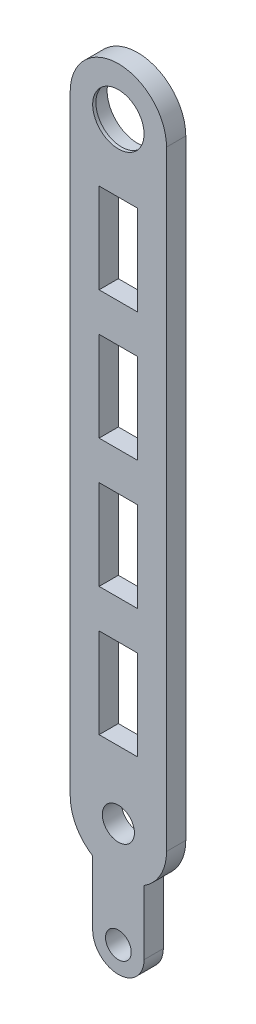
ISO-10303-21;
HEADER;
FILE_DESCRIPTION(('STEP AP214'),'2;1');
FILE_NAME('part.step','',(''),(''),'','','');
FILE_SCHEMA(('AUTOMOTIVE_DESIGN { 1 0 10303 214 1 1 1 1 }'));
ENDSEC;
DATA;
#1=APPLICATION_CONTEXT('core data for automotive mechanical design processes');
#2=APPLICATION_PROTOCOL_DEFINITION('international standard','automotive_design',2000,#1);
#3=PRODUCT_CONTEXT('',#1,'mechanical');
#4=PRODUCT('Part','Part','',(#3));
#5=PRODUCT_RELATED_PRODUCT_CATEGORY('part','',(#4));
#6=PRODUCT_DEFINITION_FORMATION('','',#4);
#7=PRODUCT_DEFINITION_CONTEXT('part definition',#1,'design');
#8=PRODUCT_DEFINITION('design','',#6,#7);
#9=PRODUCT_DEFINITION_SHAPE('','',#8);
#10=(LENGTH_UNIT() NAMED_UNIT(*) SI_UNIT(.MILLI.,.METRE.));
#11=(NAMED_UNIT(*) PLANE_ANGLE_UNIT() SI_UNIT($,.RADIAN.));
#12=(NAMED_UNIT(*) SI_UNIT($,.STERADIAN.) SOLID_ANGLE_UNIT());
#13=UNCERTAINTY_MEASURE_WITH_UNIT(LENGTH_MEASURE(1.E-05),#10,'distance_accuracy_value','');
#14=(GEOMETRIC_REPRESENTATION_CONTEXT(3) GLOBAL_UNCERTAINTY_ASSIGNED_CONTEXT((#13)) GLOBAL_UNIT_ASSIGNED_CONTEXT((#10,
#11,#12)) REPRESENTATION_CONTEXT('',''));
#15=CARTESIAN_POINT('',(0.,0.,0.));
#16=DIRECTION('',(0.,0.,1.));
#17=DIRECTION('',(1.,0.,0.));
#18=AXIS2_PLACEMENT_3D('',#15,#16,#17);
#19=CARTESIAN_POINT('',(0.,95.,6.));
#20=DIRECTION('',(0.,0.,-1.));
#21=DIRECTION('',(-1.,0.,0.));
#22=AXIS2_PLACEMENT_3D('',#19,#20,#21);
#23=CYLINDRICAL_SURFACE('',#22,9.5);
#24=CARTESIAN_POINT('',(0.,95.,0.));
#25=DIRECTION('',(0.,0.,1.));
#26=DIRECTION('',(1.,0.,0.));
#27=AXIS2_PLACEMENT_3D('',#24,#25,#26);
#28=CIRCLE('',#27,9.5);
#29=CARTESIAN_POINT('',(9.5,95.,0.));
#30=VERTEX_POINT('',#29);
#31=EDGE_CURVE('E350',#30,#30,#28,.T.);
#32=ORIENTED_EDGE('',*,*,#31,.F.);
#33=EDGE_LOOP('',(#32));
#34=FACE_BOUND('',#33,.T.);
#35=CARTESIAN_POINT('',(0.,95.,5.));
#36=DIRECTION('',(0.,0.,1.));
#37=DIRECTION('',(1.,0.,0.));
#38=AXIS2_PLACEMENT_3D('',#35,#36,#37);
#39=CIRCLE('',#38,9.5);
#40=CARTESIAN_POINT('',(9.5,95.,5.));
#41=VERTEX_POINT('',#40);
#42=EDGE_CURVE('E231',#41,#41,#39,.T.);
#43=ORIENTED_EDGE('',*,*,#42,.T.);
#44=EDGE_LOOP('',(#43));
#45=FACE_BOUND('',#44,.T.);
#46=ADVANCED_FACE('F43',(#34,#45),#23,.F.);
#47=CARTESIAN_POINT('',(0.,95.,6.));
#48=DIRECTION('',(0.,0.,1.));
#49=DIRECTION('',(1.,0.,0.));
#50=AXIS2_PLACEMENT_3D('',#47,#48,#49);
#51=PLANE('',#50);
#52=DIRECTION('',(0.,1.,0.));
#53=VECTOR('',#52,1.);
#54=CARTESIAN_POINT('',(6.00000000000322,74.,6.));
#55=LINE('',#54,#53);
#56=CARTESIAN_POINT('',(6.00000000000323,46.,6.));
#57=VERTEX_POINT('',#56);
#58=CARTESIAN_POINT('',(6.00000000000322,74.,6.));
#59=VERTEX_POINT('',#58);
#60=EDGE_CURVE('E58',#57,#59,#55,.T.);
#61=ORIENTED_EDGE('',*,*,#60,.F.);
#62=DIRECTION('',(1.,0.,0.));
#63=VECTOR('',#62,1.);
#64=CARTESIAN_POINT('',(-5.99999999999678,46.,6.));
#65=LINE('',#64,#63);
#66=CARTESIAN_POINT('',(-5.99999999999678,46.,6.));
#67=VERTEX_POINT('',#66);
#68=EDGE_CURVE('E225',#67,#57,#65,.T.);
#69=ORIENTED_EDGE('',*,*,#68,.F.);
#70=DIRECTION('',(0.,-1.,0.));
#71=VECTOR('',#70,1.);
#72=CARTESIAN_POINT('',(-5.99999999999678,74.,6.));
#73=LINE('',#72,#71);
#74=CARTESIAN_POINT('',(-5.99999999999678,74.,6.));
#75=VERTEX_POINT('',#74);
#76=EDGE_CURVE('E228',#75,#67,#73,.T.);
#77=ORIENTED_EDGE('',*,*,#76,.F.);
#78=DIRECTION('',(-1.,0.,0.));
#79=VECTOR('',#78,1.);
#80=CARTESIAN_POINT('',(-5.99999999999678,74.,6.));
#81=LINE('',#80,#79);
#82=EDGE_CURVE('E237',#59,#75,#81,.T.);
#83=ORIENTED_EDGE('',*,*,#82,.F.);
#84=EDGE_LOOP('',(#61,#69,#77,#83));
#85=FACE_BOUND('',#84,.T.);
#86=DIRECTION('',(0.,1.,0.));
#87=VECTOR('',#86,1.);
#88=CARTESIAN_POINT('',(6.00000000000343,34.,6.));
#89=LINE('',#88,#87);
#90=CARTESIAN_POINT('',(6.00000000000343,5.99999999999989,6.));
#91=VERTEX_POINT('',#90);
#92=CARTESIAN_POINT('',(6.00000000000343,34.,6.));
#93=VERTEX_POINT('',#92);
#94=EDGE_CURVE('E66',#91,#93,#89,.T.);
#95=ORIENTED_EDGE('',*,*,#94,.F.);
#96=DIRECTION('',(1.,0.,0.));
#97=VECTOR('',#96,1.);
#98=CARTESIAN_POINT('',(-5.99999999999657,5.99999999999989,6.));
#99=LINE('',#98,#97);
#100=CARTESIAN_POINT('',(-5.99999999999657,5.99999999999989,6.));
#101=VERTEX_POINT('',#100);
#102=EDGE_CURVE('E252',#101,#91,#99,.T.);
#103=ORIENTED_EDGE('',*,*,#102,.F.);
#104=DIRECTION('',(0.,-1.,0.));
#105=VECTOR('',#104,1.);
#106=CARTESIAN_POINT('',(-5.99999999999657,34.,6.));
#107=LINE('',#106,#105);
#108=CARTESIAN_POINT('',(-5.99999999999657,34.,6.));
#109=VERTEX_POINT('',#108);
#110=EDGE_CURVE('E267',#109,#101,#107,.T.);
#111=ORIENTED_EDGE('',*,*,#110,.F.);
#112=DIRECTION('',(-1.,0.,0.));
#113=VECTOR('',#112,1.);
#114=CARTESIAN_POINT('',(-5.99999999999657,34.,6.));
#115=LINE('',#114,#113);
#116=EDGE_CURVE('E263',#93,#109,#115,.T.);
#117=ORIENTED_EDGE('',*,*,#116,.F.);
#118=EDGE_LOOP('',(#95,#103,#111,#117));
#119=FACE_BOUND('',#118,.T.);
#120=DIRECTION('',(0.,1.,0.));
#121=VECTOR('',#120,1.);
#122=CARTESIAN_POINT('',(6.00000000000325,-6.00000000000011,6.));
#123=LINE('',#122,#121);
#124=CARTESIAN_POINT('',(6.00000000000326,-34.,6.));
#125=VERTEX_POINT('',#124);
#126=CARTESIAN_POINT('',(6.00000000000325,-6.0000000000001,6.));
#127=VERTEX_POINT('',#126);
#128=EDGE_CURVE('E292',#125,#127,#123,.T.);
#129=ORIENTED_EDGE('',*,*,#128,.F.);
#130=DIRECTION('',(1.,0.,0.));
#131=VECTOR('',#130,1.);
#132=CARTESIAN_POINT('',(-5.99999999999675,-34.,6.));
#133=LINE('',#132,#131);
#134=CARTESIAN_POINT('',(-5.99999999999675,-34.,6.));
#135=VERTEX_POINT('',#134);
#136=EDGE_CURVE('E282',#135,#125,#133,.T.);
#137=ORIENTED_EDGE('',*,*,#136,.F.);
#138=DIRECTION('',(0.,-1.,0.));
#139=VECTOR('',#138,1.);
#140=CARTESIAN_POINT('',(-5.99999999999675,-6.00000000000011,6.));
#141=LINE('',#140,#139);
#142=CARTESIAN_POINT('',(-5.99999999999675,-6.00000000000011,6.));
#143=VERTEX_POINT('',#142);
#144=EDGE_CURVE('E298',#143,#135,#141,.T.);
#145=ORIENTED_EDGE('',*,*,#144,.F.);
#146=DIRECTION('',(-1.,0.,0.));
#147=VECTOR('',#146,1.);
#148=CARTESIAN_POINT('',(-5.99999999999675,-6.00000000000011,6.));
#149=LINE('',#148,#147);
#150=EDGE_CURVE('E294',#127,#143,#149,.T.);
#151=ORIENTED_EDGE('',*,*,#150,.F.);
#152=EDGE_LOOP('',(#129,#137,#145,#151));
#153=FACE_BOUND('',#152,.T.);
#154=DIRECTION('',(0.,1.,0.));
#155=VECTOR('',#154,1.);
#156=CARTESIAN_POINT('',(6.00000000000325,-46.,6.));
#157=LINE('',#156,#155);
#158=CARTESIAN_POINT('',(6.00000000000326,-74.,6.));
#159=VERTEX_POINT('',#158);
#160=CARTESIAN_POINT('',(6.00000000000325,-46.,6.));
#161=VERTEX_POINT('',#160);
#162=EDGE_CURVE('E324',#159,#161,#157,.T.);
#163=ORIENTED_EDGE('',*,*,#162,.F.);
#164=DIRECTION('',(1.,0.,0.));
#165=VECTOR('',#164,1.);
#166=CARTESIAN_POINT('',(-5.99999999999674,-74.,6.));
#167=LINE('',#166,#165);
#168=CARTESIAN_POINT('',(-5.99999999999674,-74.,6.));
#169=VERTEX_POINT('',#168);
#170=EDGE_CURVE('E314',#169,#159,#167,.T.);
#171=ORIENTED_EDGE('',*,*,#170,.F.);
#172=DIRECTION('',(0.,-1.,0.));
#173=VECTOR('',#172,1.);
#174=CARTESIAN_POINT('',(-5.99999999999675,-46.,6.));
#175=LINE('',#174,#173);
#176=CARTESIAN_POINT('',(-5.99999999999675,-46.,6.));
#177=VERTEX_POINT('',#176);
#178=EDGE_CURVE('E329',#177,#169,#175,.T.);
#179=ORIENTED_EDGE('',*,*,#178,.F.);
#180=DIRECTION('',(-1.,0.,0.));
#181=VECTOR('',#180,1.);
#182=CARTESIAN_POINT('',(-5.99999999999675,-46.,6.));
#183=LINE('',#182,#181);
#184=EDGE_CURVE('E326',#161,#177,#183,.T.);
#185=ORIENTED_EDGE('',*,*,#184,.F.);
#186=EDGE_LOOP('',(#163,#171,#179,#185));
#187=FACE_BOUND('',#186,.T.);
#188=CARTESIAN_POINT('',(0.,-95.,6.));
#189=DIRECTION('',(0.,0.,1.));
#190=DIRECTION('',(1.,0.,0.));
#191=AXIS2_PLACEMENT_3D('',#188,#189,#190);
#192=CIRCLE('',#191,5.);
#193=CARTESIAN_POINT('',(5.00000000000001,-95.,6.));
#194=VERTEX_POINT('',#193);
#195=EDGE_CURVE('E347',#194,#194,#192,.T.);
#196=ORIENTED_EDGE('',*,*,#195,.F.);
#197=EDGE_LOOP('',(#196));
#198=FACE_BOUND('',#197,.T.);
#199=CARTESIAN_POINT('',(0.,95.,6.));
#200=DIRECTION('',(0.,0.,1.));
#201=DIRECTION('',(1.,0.,0.));
#202=AXIS2_PLACEMENT_3D('',#199,#200,#201);
#203=CIRCLE('',#202,15.);
#204=CARTESIAN_POINT('',(15.,95.,6.));
#205=VERTEX_POINT('',#204);
#206=CARTESIAN_POINT('',(-15.,95.,6.));
#207=VERTEX_POINT('',#206);
#208=EDGE_CURVE('E356',#205,#207,#203,.T.);
#209=ORIENTED_EDGE('',*,*,#208,.T.);
#210=DIRECTION('',(0.,-1.,0.));
#211=VECTOR('',#210,1.);
#212=CARTESIAN_POINT('',(-15.,-95.,6.));
#213=LINE('',#212,#211);
#214=CARTESIAN_POINT('',(-15.,-95.,6.));
#215=VERTEX_POINT('',#214);
#216=EDGE_CURVE('E359',#207,#215,#213,.T.);
#217=ORIENTED_EDGE('',*,*,#216,.T.);
#218=CARTESIAN_POINT('',(0.,-95.,6.));
#219=DIRECTION('',(0.,0.,1.));
#220=DIRECTION('',(1.,0.,0.));
#221=AXIS2_PLACEMENT_3D('',#218,#219,#220);
#222=CIRCLE('',#221,15.);
#223=CARTESIAN_POINT('',(-8.,-107.68857754045,6.));
#224=VERTEX_POINT('',#223);
#225=EDGE_CURVE('E362',#215,#224,#222,.T.);
#226=ORIENTED_EDGE('',*,*,#225,.T.);
#227=DIRECTION('',(0.,-1.,0.));
#228=VECTOR('',#227,1.);
#229=CARTESIAN_POINT('',(-8.,-127.688577540449,6.));
#230=LINE('',#229,#228);
#231=CARTESIAN_POINT('',(-8.,-127.688577540449,6.));
#232=VERTEX_POINT('',#231);
#233=EDGE_CURVE('E364',#224,#232,#230,.T.);
#234=ORIENTED_EDGE('',*,*,#233,.T.);
#235=CARTESIAN_POINT('',(0.,-127.688577540449,6.));
#236=DIRECTION('',(0.,0.,1.));
#237=DIRECTION('',(1.,0.,0.));
#238=AXIS2_PLACEMENT_3D('',#235,#236,#237);
#239=CIRCLE('',#238,8.);
#240=CARTESIAN_POINT('',(8.,-127.688577540449,6.));
#241=VERTEX_POINT('',#240);
#242=EDGE_CURVE('E366',#232,#241,#239,.T.);
#243=ORIENTED_EDGE('',*,*,#242,.T.);
#244=DIRECTION('',(0.,1.,0.));
#245=VECTOR('',#244,1.);
#246=CARTESIAN_POINT('',(8.,-127.688577540449,6.));
#247=LINE('',#246,#245);
#248=CARTESIAN_POINT('',(8.,-107.68857754045,6.));
#249=VERTEX_POINT('',#248);
#250=EDGE_CURVE('E368',#241,#249,#247,.T.);
#251=ORIENTED_EDGE('',*,*,#250,.T.);
#252=CARTESIAN_POINT('',(0.,-95.,6.));
#253=DIRECTION('',(0.,0.,1.));
#254=DIRECTION('',(1.,0.,0.));
#255=AXIS2_PLACEMENT_3D('',#252,#253,#254);
#256=CIRCLE('',#255,15.);
#257=CARTESIAN_POINT('',(15.,-95.,6.));
#258=VERTEX_POINT('',#257);
#259=EDGE_CURVE('E370',#249,#258,#256,.T.);
#260=ORIENTED_EDGE('',*,*,#259,.T.);
#261=DIRECTION('',(0.,1.,0.));
#262=VECTOR('',#261,1.);
#263=CARTESIAN_POINT('',(15.,-95.,6.));
#264=LINE('',#263,#262);
#265=EDGE_CURVE('E372',#258,#205,#264,.T.);
#266=ORIENTED_EDGE('',*,*,#265,.T.);
#267=EDGE_LOOP('',(#209,#217,#226,#234,#243,#251,#260,#266));
#268=FACE_BOUND('',#267,.T.);
#269=CARTESIAN_POINT('',(0.,-127.688577540449,6.));
#270=DIRECTION('',(0.,0.,1.));
#271=DIRECTION('',(1.,0.,0.));
#272=AXIS2_PLACEMENT_3D('',#269,#270,#271);
#273=CIRCLE('',#272,4.);
#274=CARTESIAN_POINT('',(4.,-127.688577540449,6.));
#275=VERTEX_POINT('',#274);
#276=EDGE_CURVE('E341',#275,#275,#273,.T.);
#277=ORIENTED_EDGE('',*,*,#276,.F.);
#278=EDGE_LOOP('',(#277));
#279=FACE_BOUND('',#278,.T.);
#280=CARTESIAN_POINT('',(0.,95.,6.));
#281=DIRECTION('',(0.,0.,1.));
#282=DIRECTION('',(1.,0.,0.));
#283=AXIS2_PLACEMENT_3D('',#280,#281,#282);
#284=CIRCLE('',#283,8.);
#285=CARTESIAN_POINT('',(8.00000000000001,95.,6.));
#286=VERTEX_POINT('',#285);
#287=EDGE_CURVE('E568',#286,#286,#284,.T.);
#288=ORIENTED_EDGE('',*,*,#287,.F.);
#289=EDGE_LOOP('',(#288));
#290=FACE_BOUND('',#289,.T.);
#291=ADVANCED_FACE('F430',(#85,#119,#153,#187,#198,#268,#279,#290),#51,.T.);
#292=CARTESIAN_POINT('',(0.,95.,0.));
#293=DIRECTION('',(0.,0.,1.));
#294=DIRECTION('',(1.,0.,0.));
#295=AXIS2_PLACEMENT_3D('',#292,#293,#294);
#296=PLANE('',#295);
#297=DIRECTION('',(1.,0.,0.));
#298=VECTOR('',#297,1.);
#299=CARTESIAN_POINT('',(-5.99999999999678,46.,0.));
#300=LINE('',#299,#298);
#301=CARTESIAN_POINT('',(-5.99999999999678,46.,0.));
#302=VERTEX_POINT('',#301);
#303=CARTESIAN_POINT('',(6.00000000000323,46.,0.));
#304=VERTEX_POINT('',#303);
#305=EDGE_CURVE('E212',#302,#304,#300,.T.);
#306=ORIENTED_EDGE('',*,*,#305,.T.);
#307=DIRECTION('',(0.,1.,0.));
#308=VECTOR('',#307,1.);
#309=CARTESIAN_POINT('',(6.00000000000322,74.,0.));
#310=LINE('',#309,#308);
#311=CARTESIAN_POINT('',(6.00000000000322,74.,0.));
#312=VERTEX_POINT('',#311);
#313=EDGE_CURVE('E206',#304,#312,#310,.T.);
#314=ORIENTED_EDGE('',*,*,#313,.T.);
#315=DIRECTION('',(-1.,0.,0.));
#316=VECTOR('',#315,1.);
#317=CARTESIAN_POINT('',(-5.99999999999678,74.,0.));
#318=LINE('',#317,#316);
#319=CARTESIAN_POINT('',(-5.99999999999678,74.,0.));
#320=VERTEX_POINT('',#319);
#321=EDGE_CURVE('E216',#312,#320,#318,.T.);
#322=ORIENTED_EDGE('',*,*,#321,.T.);
#323=DIRECTION('',(0.,-1.,0.));
#324=VECTOR('',#323,1.);
#325=CARTESIAN_POINT('',(-5.99999999999678,74.,0.));
#326=LINE('',#325,#324);
#327=EDGE_CURVE('E220',#320,#302,#326,.T.);
#328=ORIENTED_EDGE('',*,*,#327,.T.);
#329=EDGE_LOOP('',(#306,#314,#322,#328));
#330=FACE_BOUND('',#329,.T.);
#331=DIRECTION('',(1.,0.,0.));
#332=VECTOR('',#331,1.);
#333=CARTESIAN_POINT('',(-5.99999999999657,5.99999999999989,0.));
#334=LINE('',#333,#332);
#335=CARTESIAN_POINT('',(-5.99999999999657,5.99999999999989,0.));
#336=VERTEX_POINT('',#335);
#337=CARTESIAN_POINT('',(6.00000000000343,5.99999999999989,0.));
#338=VERTEX_POINT('',#337);
#339=EDGE_CURVE('E258',#336,#338,#334,.T.);
#340=ORIENTED_EDGE('',*,*,#339,.T.);
#341=DIRECTION('',(0.,1.,0.));
#342=VECTOR('',#341,1.);
#343=CARTESIAN_POINT('',(6.00000000000343,34.,0.));
#344=LINE('',#343,#342);
#345=CARTESIAN_POINT('',(6.00000000000343,34.,0.));
#346=VERTEX_POINT('',#345);
#347=EDGE_CURVE('E248',#338,#346,#344,.T.);
#348=ORIENTED_EDGE('',*,*,#347,.T.);
#349=DIRECTION('',(-1.,0.,0.));
#350=VECTOR('',#349,1.);
#351=CARTESIAN_POINT('',(-5.99999999999657,34.,0.));
#352=LINE('',#351,#350);
#353=CARTESIAN_POINT('',(-5.99999999999657,34.,0.));
#354=VERTEX_POINT('',#353);
#355=EDGE_CURVE('E251',#346,#354,#352,.T.);
#356=ORIENTED_EDGE('',*,*,#355,.T.);
#357=DIRECTION('',(0.,-1.,0.));
#358=VECTOR('',#357,1.);
#359=CARTESIAN_POINT('',(-5.99999999999657,34.,0.));
#360=LINE('',#359,#358);
#361=EDGE_CURVE('E255',#354,#336,#360,.T.);
#362=ORIENTED_EDGE('',*,*,#361,.T.);
#363=EDGE_LOOP('',(#340,#348,#356,#362));
#364=FACE_BOUND('',#363,.T.);
#365=DIRECTION('',(1.,0.,0.));
#366=VECTOR('',#365,1.);
#367=CARTESIAN_POINT('',(-5.99999999999675,-34.,0.));
#368=LINE('',#367,#366);
#369=CARTESIAN_POINT('',(-5.99999999999675,-34.,0.));
#370=VERTEX_POINT('',#369);
#371=CARTESIAN_POINT('',(6.00000000000326,-34.,0.));
#372=VERTEX_POINT('',#371);
#373=EDGE_CURVE('E288',#370,#372,#368,.T.);
#374=ORIENTED_EDGE('',*,*,#373,.T.);
#375=DIRECTION('',(0.,1.,0.));
#376=VECTOR('',#375,1.);
#377=CARTESIAN_POINT('',(6.00000000000325,-6.00000000000011,0.));
#378=LINE('',#377,#376);
#379=CARTESIAN_POINT('',(6.00000000000325,-6.00000000000011,0.));
#380=VERTEX_POINT('',#379);
#381=EDGE_CURVE('E278',#372,#380,#378,.T.);
#382=ORIENTED_EDGE('',*,*,#381,.T.);
#383=DIRECTION('',(-1.,0.,0.));
#384=VECTOR('',#383,1.);
#385=CARTESIAN_POINT('',(-5.99999999999675,-6.00000000000011,0.));
#386=LINE('',#385,#384);
#387=CARTESIAN_POINT('',(-5.99999999999675,-6.0000000000001,0.));
#388=VERTEX_POINT('',#387);
#389=EDGE_CURVE('E281',#380,#388,#386,.T.);
#390=ORIENTED_EDGE('',*,*,#389,.T.);
#391=DIRECTION('',(0.,-1.,0.));
#392=VECTOR('',#391,1.);
#393=CARTESIAN_POINT('',(-5.99999999999675,-6.00000000000011,0.));
#394=LINE('',#393,#392);
#395=EDGE_CURVE('E285',#388,#370,#394,.T.);
#396=ORIENTED_EDGE('',*,*,#395,.T.);
#397=EDGE_LOOP('',(#374,#382,#390,#396));
#398=FACE_BOUND('',#397,.T.);
#399=DIRECTION('',(1.,0.,0.));
#400=VECTOR('',#399,1.);
#401=CARTESIAN_POINT('',(-5.99999999999674,-74.,0.));
#402=LINE('',#401,#400);
#403=CARTESIAN_POINT('',(-5.99999999999674,-74.,0.));
#404=VERTEX_POINT('',#403);
#405=CARTESIAN_POINT('',(6.00000000000326,-74.,0.));
#406=VERTEX_POINT('',#405);
#407=EDGE_CURVE('E320',#404,#406,#402,.T.);
#408=ORIENTED_EDGE('',*,*,#407,.T.);
#409=DIRECTION('',(0.,1.,0.));
#410=VECTOR('',#409,1.);
#411=CARTESIAN_POINT('',(6.00000000000325,-46.,0.));
#412=LINE('',#411,#410);
#413=CARTESIAN_POINT('',(6.00000000000325,-46.,0.));
#414=VERTEX_POINT('',#413);
#415=EDGE_CURVE('E310',#406,#414,#412,.T.);
#416=ORIENTED_EDGE('',*,*,#415,.T.);
#417=DIRECTION('',(-1.,0.,0.));
#418=VECTOR('',#417,1.);
#419=CARTESIAN_POINT('',(-5.99999999999675,-46.,0.));
#420=LINE('',#419,#418);
#421=CARTESIAN_POINT('',(-5.99999999999675,-46.,0.));
#422=VERTEX_POINT('',#421);
#423=EDGE_CURVE('E313',#414,#422,#420,.T.);
#424=ORIENTED_EDGE('',*,*,#423,.T.);
#425=DIRECTION('',(0.,-1.,0.));
#426=VECTOR('',#425,1.);
#427=CARTESIAN_POINT('',(-5.99999999999675,-46.,0.));
#428=LINE('',#427,#426);
#429=EDGE_CURVE('E317',#422,#404,#428,.T.);
#430=ORIENTED_EDGE('',*,*,#429,.T.);
#431=EDGE_LOOP('',(#408,#416,#424,#430));
#432=FACE_BOUND('',#431,.T.);
#433=CARTESIAN_POINT('',(0.,95.,0.));
#434=DIRECTION('',(0.,0.,1.));
#435=DIRECTION('',(1.,0.,0.));
#436=AXIS2_PLACEMENT_3D('',#433,#434,#435);
#437=CIRCLE('',#436,15.);
#438=CARTESIAN_POINT('',(15.,95.,0.));
#439=VERTEX_POINT('',#438);
#440=CARTESIAN_POINT('',(-15.,95.,0.));
#441=VERTEX_POINT('',#440);
#442=EDGE_CURVE('E355',#439,#441,#437,.T.);
#443=ORIENTED_EDGE('',*,*,#442,.F.);
#444=DIRECTION('',(0.,1.,0.));
#445=VECTOR('',#444,1.);
#446=CARTESIAN_POINT('',(15.,-95.,0.));
#447=LINE('',#446,#445);
#448=CARTESIAN_POINT('',(15.,-95.,0.));
#449=VERTEX_POINT('',#448);
#450=EDGE_CURVE('E360',#449,#439,#447,.T.);
#451=ORIENTED_EDGE('',*,*,#450,.F.);
#452=CARTESIAN_POINT('',(0.,-95.,0.));
#453=DIRECTION('',(0.,0.,1.));
#454=DIRECTION('',(1.,0.,0.));
#455=AXIS2_PLACEMENT_3D('',#452,#453,#454);
#456=CIRCLE('',#455,15.);
#457=CARTESIAN_POINT('',(8.,-107.68857754045,0.));
#458=VERTEX_POINT('',#457);
#459=EDGE_CURVE('E387',#458,#449,#456,.T.);
#460=ORIENTED_EDGE('',*,*,#459,.F.);
#461=DIRECTION('',(0.,1.,0.));
#462=VECTOR('',#461,1.);
#463=CARTESIAN_POINT('',(8.,-127.688577540449,0.));
#464=LINE('',#463,#462);
#465=CARTESIAN_POINT('',(8.,-127.688577540449,0.));
#466=VERTEX_POINT('',#465);
#467=EDGE_CURVE('E385',#466,#458,#464,.T.);
#468=ORIENTED_EDGE('',*,*,#467,.F.);
#469=CARTESIAN_POINT('',(0.,-127.688577540449,0.));
#470=DIRECTION('',(0.,0.,1.));
#471=DIRECTION('',(1.,0.,0.));
#472=AXIS2_PLACEMENT_3D('',#469,#470,#471);
#473=CIRCLE('',#472,8.);
#474=CARTESIAN_POINT('',(-8.,-127.688577540449,0.));
#475=VERTEX_POINT('',#474);
#476=EDGE_CURVE('E383',#475,#466,#473,.T.);
#477=ORIENTED_EDGE('',*,*,#476,.F.);
#478=DIRECTION('',(0.,-1.,0.));
#479=VECTOR('',#478,1.);
#480=CARTESIAN_POINT('',(-8.,-127.688577540449,0.));
#481=LINE('',#480,#479);
#482=CARTESIAN_POINT('',(-8.,-107.68857754045,0.));
#483=VERTEX_POINT('',#482);
#484=EDGE_CURVE('E381',#483,#475,#481,.T.);
#485=ORIENTED_EDGE('',*,*,#484,.F.);
#486=CARTESIAN_POINT('',(0.,-95.,0.));
#487=DIRECTION('',(0.,0.,1.));
#488=DIRECTION('',(1.,0.,0.));
#489=AXIS2_PLACEMENT_3D('',#486,#487,#488);
#490=CIRCLE('',#489,15.);
#491=CARTESIAN_POINT('',(-15.,-95.,0.));
#492=VERTEX_POINT('',#491);
#493=EDGE_CURVE('E379',#492,#483,#490,.T.);
#494=ORIENTED_EDGE('',*,*,#493,.F.);
#495=DIRECTION('',(0.,-1.,0.));
#496=VECTOR('',#495,1.);
#497=CARTESIAN_POINT('',(-15.,-95.,0.));
#498=LINE('',#497,#496);
#499=EDGE_CURVE('E377',#441,#492,#498,.T.);
#500=ORIENTED_EDGE('',*,*,#499,.F.);
#501=EDGE_LOOP('',(#443,#451,#460,#468,#477,#485,#494,#500));
#502=FACE_BOUND('',#501,.T.);
#503=ORIENTED_EDGE('',*,*,#31,.T.);
#504=EDGE_LOOP('',(#503));
#505=FACE_BOUND('',#504,.T.);
#506=CARTESIAN_POINT('',(0.,-95.,0.));
#507=DIRECTION('',(0.,0.,1.));
#508=DIRECTION('',(1.,0.,0.));
#509=AXIS2_PLACEMENT_3D('',#506,#507,#508);
#510=CIRCLE('',#509,5.);
#511=CARTESIAN_POINT('',(5.00000000000001,-95.,0.));
#512=VERTEX_POINT('',#511);
#513=EDGE_CURVE('E344',#512,#512,#510,.T.);
#514=ORIENTED_EDGE('',*,*,#513,.T.);
#515=EDGE_LOOP('',(#514));
#516=FACE_BOUND('',#515,.T.);
#517=CARTESIAN_POINT('',(0.,-127.688577540449,0.));
#518=DIRECTION('',(0.,0.,1.));
#519=DIRECTION('',(1.,0.,0.));
#520=AXIS2_PLACEMENT_3D('',#517,#518,#519);
#521=CIRCLE('',#520,4.);
#522=CARTESIAN_POINT('',(4.,-127.688577540449,0.));
#523=VERTEX_POINT('',#522);
#524=EDGE_CURVE('E244',#523,#523,#521,.T.);
#525=ORIENTED_EDGE('',*,*,#524,.T.);
#526=EDGE_LOOP('',(#525));
#527=FACE_BOUND('',#526,.T.);
#528=ADVANCED_FACE('F222',(#330,#364,#398,#432,#502,#505,#516,#527),#296,.F.);
#529=CARTESIAN_POINT('',(0.,95.,6.));
#530=DIRECTION('',(0.,0.,-1.));
#531=DIRECTION('',(-1.,0.,0.));
#532=AXIS2_PLACEMENT_3D('',#529,#530,#531);
#533=CYLINDRICAL_SURFACE('',#532,15.);
#534=ORIENTED_EDGE('',*,*,#442,.T.);
#535=DIRECTION('',(0.,0.,-1.));
#536=VECTOR('',#535,1.);
#537=CARTESIAN_POINT('',(-15.,95.,6.));
#538=LINE('',#537,#536);
#539=EDGE_CURVE('E12',#207,#441,#538,.T.);
#540=ORIENTED_EDGE('',*,*,#539,.F.);
#541=ORIENTED_EDGE('',*,*,#208,.F.);
#542=DIRECTION('',(0.,0.,-1.));
#543=VECTOR('',#542,1.);
#544=CARTESIAN_POINT('',(15.,95.,6.));
#545=LINE('',#544,#543);
#546=EDGE_CURVE('E374',#205,#439,#545,.T.);
#547=ORIENTED_EDGE('',*,*,#546,.T.);
#548=EDGE_LOOP('',(#534,#540,#541,#547));
#549=FACE_BOUND('',#548,.T.);
#550=ADVANCED_FACE('F45',(#549),#533,.T.);
#551=CARTESIAN_POINT('',(-15.,-95.,6.));
#552=DIRECTION('',(1.,0.,0.));
#553=DIRECTION('',(0.,0.,-1.));
#554=AXIS2_PLACEMENT_3D('',#551,#552,#553);
#555=PLANE('',#554);
#556=ORIENTED_EDGE('',*,*,#499,.T.);
#557=DIRECTION('',(0.,0.,-1.));
#558=VECTOR('',#557,1.);
#559=CARTESIAN_POINT('',(-15.,-95.,6.));
#560=LINE('',#559,#558);
#561=EDGE_CURVE('E51',#215,#492,#560,.T.);
#562=ORIENTED_EDGE('',*,*,#561,.F.);
#563=ORIENTED_EDGE('',*,*,#216,.F.);
#564=ORIENTED_EDGE('',*,*,#539,.T.);
#565=EDGE_LOOP('',(#556,#562,#563,#564));
#566=FACE_BOUND('',#565,.T.);
#567=ADVANCED_FACE('F435',(#566),#555,.F.);
#568=CARTESIAN_POINT('',(0.,-95.,6.));
#569=DIRECTION('',(0.,0.,-1.));
#570=DIRECTION('',(-1.,0.,0.));
#571=AXIS2_PLACEMENT_3D('',#568,#569,#570);
#572=CYLINDRICAL_SURFACE('',#571,15.);
#573=ORIENTED_EDGE('',*,*,#493,.T.);
#574=DIRECTION('',(0.,0.,-1.));
#575=VECTOR('',#574,1.);
#576=CARTESIAN_POINT('',(-8.,-107.68857754045,6.));
#577=LINE('',#576,#575);
#578=EDGE_CURVE('E404',#224,#483,#577,.T.);
#579=ORIENTED_EDGE('',*,*,#578,.F.);
#580=ORIENTED_EDGE('',*,*,#225,.F.);
#581=ORIENTED_EDGE('',*,*,#561,.T.);
#582=EDGE_LOOP('',(#573,#579,#580,#581));
#583=FACE_BOUND('',#582,.T.);
#584=ADVANCED_FACE('F411',(#583),#572,.T.);
#585=CARTESIAN_POINT('',(-8.,-127.688577540449,6.));
#586=DIRECTION('',(1.,0.,0.));
#587=DIRECTION('',(0.,0.,-1.));
#588=AXIS2_PLACEMENT_3D('',#585,#586,#587);
#589=PLANE('',#588);
#590=ORIENTED_EDGE('',*,*,#484,.T.);
#591=DIRECTION('',(0.,0.,-1.));
#592=VECTOR('',#591,1.);
#593=CARTESIAN_POINT('',(-8.,-127.688577540449,6.));
#594=LINE('',#593,#592);
#595=EDGE_CURVE('E400',#232,#475,#594,.T.);
#596=ORIENTED_EDGE('',*,*,#595,.F.);
#597=ORIENTED_EDGE('',*,*,#233,.F.);
#598=ORIENTED_EDGE('',*,*,#578,.T.);
#599=EDGE_LOOP('',(#590,#596,#597,#598));
#600=FACE_BOUND('',#599,.T.);
#601=ADVANCED_FACE('F422',(#600),#589,.F.);
#602=CARTESIAN_POINT('',(0.,-127.688577540449,6.));
#603=DIRECTION('',(0.,0.,-1.));
#604=DIRECTION('',(-1.,0.,0.));
#605=AXIS2_PLACEMENT_3D('',#602,#603,#604);
#606=CYLINDRICAL_SURFACE('',#605,8.);
#607=ORIENTED_EDGE('',*,*,#476,.T.);
#608=DIRECTION('',(0.,0.,-1.));
#609=VECTOR('',#608,1.);
#610=CARTESIAN_POINT('',(8.,-127.688577540449,6.));
#611=LINE('',#610,#609);
#612=EDGE_CURVE('E398',#241,#466,#611,.T.);
#613=ORIENTED_EDGE('',*,*,#612,.F.);
#614=ORIENTED_EDGE('',*,*,#242,.F.);
#615=ORIENTED_EDGE('',*,*,#595,.T.);
#616=EDGE_LOOP('',(#607,#613,#614,#615));
#617=FACE_BOUND('',#616,.T.);
#618=ADVANCED_FACE('F426',(#617),#606,.T.);
#619=CARTESIAN_POINT('',(8.,-127.688577540449,6.));
#620=DIRECTION('',(-1.,0.,0.));
#621=DIRECTION('',(0.,-1.,0.));
#622=AXIS2_PLACEMENT_3D('',#619,#620,#621);
#623=PLANE('',#622);
#624=ORIENTED_EDGE('',*,*,#467,.T.);
#625=DIRECTION('',(0.,0.,-1.));
#626=VECTOR('',#625,1.);
#627=CARTESIAN_POINT('',(8.,-107.68857754045,6.));
#628=LINE('',#627,#626);
#629=EDGE_CURVE('E395',#249,#458,#628,.T.);
#630=ORIENTED_EDGE('',*,*,#629,.F.);
#631=ORIENTED_EDGE('',*,*,#250,.F.);
#632=ORIENTED_EDGE('',*,*,#612,.T.);
#633=EDGE_LOOP('',(#624,#630,#631,#632));
#634=FACE_BOUND('',#633,.T.);
#635=ADVANCED_FACE('F448',(#634),#623,.F.);
#636=CARTESIAN_POINT('',(0.,-95.,6.));
#637=DIRECTION('',(0.,0.,-1.));
#638=DIRECTION('',(-1.,0.,0.));
#639=AXIS2_PLACEMENT_3D('',#636,#637,#638);
#640=CYLINDRICAL_SURFACE('',#639,15.);
#641=ORIENTED_EDGE('',*,*,#459,.T.);
#642=DIRECTION('',(0.,0.,-1.));
#643=VECTOR('',#642,1.);
#644=CARTESIAN_POINT('',(15.,-95.,6.));
#645=LINE('',#644,#643);
#646=EDGE_CURVE('E392',#258,#449,#645,.T.);
#647=ORIENTED_EDGE('',*,*,#646,.F.);
#648=ORIENTED_EDGE('',*,*,#259,.F.);
#649=ORIENTED_EDGE('',*,*,#629,.T.);
#650=EDGE_LOOP('',(#641,#647,#648,#649));
#651=FACE_BOUND('',#650,.T.);
#652=ADVANCED_FACE('F446',(#651),#640,.T.);
#653=CARTESIAN_POINT('',(15.,-95.,6.));
#654=DIRECTION('',(-1.,0.,0.));
#655=DIRECTION('',(0.,0.,1.));
#656=AXIS2_PLACEMENT_3D('',#653,#654,#655);
#657=PLANE('',#656);
#658=ORIENTED_EDGE('',*,*,#450,.T.);
#659=ORIENTED_EDGE('',*,*,#546,.F.);
#660=ORIENTED_EDGE('',*,*,#265,.F.);
#661=ORIENTED_EDGE('',*,*,#646,.T.);
#662=EDGE_LOOP('',(#658,#659,#660,#661));
#663=FACE_BOUND('',#662,.T.);
#664=ADVANCED_FACE('F441',(#663),#657,.F.);
#665=CARTESIAN_POINT('',(0.,-95.,6.));
#666=DIRECTION('',(0.,0.,-1.));
#667=DIRECTION('',(-1.,0.,0.));
#668=AXIS2_PLACEMENT_3D('',#665,#666,#667);
#669=CYLINDRICAL_SURFACE('',#668,5.);
#670=ORIENTED_EDGE('',*,*,#195,.T.);
#671=EDGE_LOOP('',(#670));
#672=FACE_BOUND('',#671,.T.);
#673=ORIENTED_EDGE('',*,*,#513,.F.);
#674=EDGE_LOOP('',(#673));
#675=FACE_BOUND('',#674,.T.);
#676=ADVANCED_FACE('F469',(#672,#675),#669,.F.);
#677=CARTESIAN_POINT('',(0.,-127.688577540449,6.));
#678=DIRECTION('',(0.,0.,-1.));
#679=DIRECTION('',(-1.,0.,0.));
#680=AXIS2_PLACEMENT_3D('',#677,#678,#679);
#681=CYLINDRICAL_SURFACE('',#680,4.);
#682=ORIENTED_EDGE('',*,*,#276,.T.);
#683=EDGE_LOOP('',(#682));
#684=FACE_BOUND('',#683,.T.);
#685=ORIENTED_EDGE('',*,*,#524,.F.);
#686=EDGE_LOOP('',(#685));
#687=FACE_BOUND('',#686,.T.);
#688=ADVANCED_FACE('F478',(#684,#687),#681,.F.);
#689=CARTESIAN_POINT('',(6.00000000000325,-46.,0.));
#690=DIRECTION('',(1.,0.,0.));
#691=DIRECTION('',(0.,1.,0.));
#692=AXIS2_PLACEMENT_3D('',#689,#690,#691);
#693=PLANE('',#692);
#694=ORIENTED_EDGE('',*,*,#162,.T.);
#695=DIRECTION('',(0.,0.,1.));
#696=VECTOR('',#695,1.);
#697=CARTESIAN_POINT('',(6.00000000000325,-46.,0.));
#698=LINE('',#697,#696);
#699=EDGE_CURVE('E323',#414,#161,#698,.T.);
#700=ORIENTED_EDGE('',*,*,#699,.F.);
#701=ORIENTED_EDGE('',*,*,#415,.F.);
#702=DIRECTION('',(0.,0.,1.));
#703=VECTOR('',#702,1.);
#704=CARTESIAN_POINT('',(6.00000000000326,-74.,0.));
#705=LINE('',#704,#703);
#706=EDGE_CURVE('E295',#406,#159,#705,.T.);
#707=ORIENTED_EDGE('',*,*,#706,.T.);
#708=EDGE_LOOP('',(#694,#700,#701,#707));
#709=FACE_BOUND('',#708,.T.);
#710=ADVANCED_FACE('F483',(#709),#693,.F.);
#711=CARTESIAN_POINT('',(-5.99999999999674,-74.,0.));
#712=DIRECTION('',(0.,-1.,0.));
#713=DIRECTION('',(0.,0.,-1.));
#714=AXIS2_PLACEMENT_3D('',#711,#712,#713);
#715=PLANE('',#714);
#716=ORIENTED_EDGE('',*,*,#170,.T.);
#717=ORIENTED_EDGE('',*,*,#706,.F.);
#718=ORIENTED_EDGE('',*,*,#407,.F.);
#719=DIRECTION('',(0.,0.,1.));
#720=VECTOR('',#719,1.);
#721=CARTESIAN_POINT('',(-5.99999999999674,-74.,0.));
#722=LINE('',#721,#720);
#723=EDGE_CURVE('E335',#404,#169,#722,.T.);
#724=ORIENTED_EDGE('',*,*,#723,.T.);
#725=EDGE_LOOP('',(#716,#717,#718,#724));
#726=FACE_BOUND('',#725,.T.);
#727=ADVANCED_FACE('F496',(#726),#715,.F.);
#728=CARTESIAN_POINT('',(-5.99999999999675,-46.,0.));
#729=DIRECTION('',(-1.,0.,0.));
#730=DIRECTION('',(0.,-1.,0.));
#731=AXIS2_PLACEMENT_3D('',#728,#729,#730);
#732=PLANE('',#731);
#733=ORIENTED_EDGE('',*,*,#178,.T.);
#734=ORIENTED_EDGE('',*,*,#723,.F.);
#735=ORIENTED_EDGE('',*,*,#429,.F.);
#736=DIRECTION('',(0.,0.,1.));
#737=VECTOR('',#736,1.);
#738=CARTESIAN_POINT('',(-5.99999999999675,-46.,0.));
#739=LINE('',#738,#737);
#740=EDGE_CURVE('E337',#422,#177,#739,.T.);
#741=ORIENTED_EDGE('',*,*,#740,.T.);
#742=EDGE_LOOP('',(#733,#734,#735,#741));
#743=FACE_BOUND('',#742,.T.);
#744=ADVANCED_FACE('F504',(#743),#732,.F.);
#745=CARTESIAN_POINT('',(-5.99999999999675,-46.,0.));
#746=DIRECTION('',(0.,1.,0.));
#747=DIRECTION('',(0.,0.,1.));
#748=AXIS2_PLACEMENT_3D('',#745,#746,#747);
#749=PLANE('',#748);
#750=ORIENTED_EDGE('',*,*,#184,.T.);
#751=ORIENTED_EDGE('',*,*,#740,.F.);
#752=ORIENTED_EDGE('',*,*,#423,.F.);
#753=ORIENTED_EDGE('',*,*,#699,.T.);
#754=EDGE_LOOP('',(#750,#751,#752,#753));
#755=FACE_BOUND('',#754,.T.);
#756=ADVANCED_FACE('F500',(#755),#749,.F.);
#757=CARTESIAN_POINT('',(6.00000000000325,-6.00000000000011,0.));
#758=DIRECTION('',(1.,0.,0.));
#759=DIRECTION('',(0.,1.,0.));
#760=AXIS2_PLACEMENT_3D('',#757,#758,#759);
#761=PLANE('',#760);
#762=ORIENTED_EDGE('',*,*,#128,.T.);
#763=DIRECTION('',(0.,0.,1.));
#764=VECTOR('',#763,1.);
#765=CARTESIAN_POINT('',(6.00000000000325,-6.00000000000011,0.));
#766=LINE('',#765,#764);
#767=EDGE_CURVE('E291',#380,#127,#766,.T.);
#768=ORIENTED_EDGE('',*,*,#767,.F.);
#769=ORIENTED_EDGE('',*,*,#381,.F.);
#770=DIRECTION('',(0.,0.,1.));
#771=VECTOR('',#770,1.);
#772=CARTESIAN_POINT('',(6.00000000000326,-34.,0.));
#773=LINE('',#772,#771);
#774=EDGE_CURVE('E264',#372,#125,#773,.T.);
#775=ORIENTED_EDGE('',*,*,#774,.T.);
#776=EDGE_LOOP('',(#762,#768,#769,#775));
#777=FACE_BOUND('',#776,.T.);
#778=ADVANCED_FACE('F503',(#777),#761,.F.);
#779=CARTESIAN_POINT('',(-5.99999999999675,-34.,0.));
#780=DIRECTION('',(0.,-1.,0.));
#781=DIRECTION('',(1.,0.,0.));
#782=AXIS2_PLACEMENT_3D('',#779,#780,#781);
#783=PLANE('',#782);
#784=ORIENTED_EDGE('',*,*,#136,.T.);
#785=ORIENTED_EDGE('',*,*,#774,.F.);
#786=ORIENTED_EDGE('',*,*,#373,.F.);
#787=DIRECTION('',(0.,0.,1.));
#788=VECTOR('',#787,1.);
#789=CARTESIAN_POINT('',(-5.99999999999675,-34.,0.));
#790=LINE('',#789,#788);
#791=EDGE_CURVE('E304',#370,#135,#790,.T.);
#792=ORIENTED_EDGE('',*,*,#791,.T.);
#793=EDGE_LOOP('',(#784,#785,#786,#792));
#794=FACE_BOUND('',#793,.T.);
#795=ADVANCED_FACE('F514',(#794),#783,.F.);
#796=CARTESIAN_POINT('',(-5.99999999999675,-6.00000000000011,0.));
#797=DIRECTION('',(-1.,0.,0.));
#798=DIRECTION('',(0.,-1.,0.));
#799=AXIS2_PLACEMENT_3D('',#796,#797,#798);
#800=PLANE('',#799);
#801=ORIENTED_EDGE('',*,*,#144,.T.);
#802=ORIENTED_EDGE('',*,*,#791,.F.);
#803=ORIENTED_EDGE('',*,*,#395,.F.);
#804=DIRECTION('',(0.,0.,1.));
#805=VECTOR('',#804,1.);
#806=CARTESIAN_POINT('',(-5.99999999999675,-6.00000000000011,0.));
#807=LINE('',#806,#805);
#808=EDGE_CURVE('E306',#388,#143,#807,.T.);
#809=ORIENTED_EDGE('',*,*,#808,.T.);
#810=EDGE_LOOP('',(#801,#802,#803,#809));
#811=FACE_BOUND('',#810,.T.);
#812=ADVANCED_FACE('F520',(#811),#800,.F.);
#813=CARTESIAN_POINT('',(-5.99999999999675,-6.00000000000011,0.));
#814=DIRECTION('',(0.,1.,0.));
#815=DIRECTION('',(0.,0.,1.));
#816=AXIS2_PLACEMENT_3D('',#813,#814,#815);
#817=PLANE('',#816);
#818=ORIENTED_EDGE('',*,*,#150,.T.);
#819=ORIENTED_EDGE('',*,*,#808,.F.);
#820=ORIENTED_EDGE('',*,*,#389,.F.);
#821=ORIENTED_EDGE('',*,*,#767,.T.);
#822=EDGE_LOOP('',(#818,#819,#820,#821));
#823=FACE_BOUND('',#822,.T.);
#824=ADVANCED_FACE('F516',(#823),#817,.F.);
#825=CARTESIAN_POINT('',(6.00000000000343,34.,0.));
#826=DIRECTION('',(1.,0.,0.));
#827=DIRECTION('',(0.,1.,0.));
#828=AXIS2_PLACEMENT_3D('',#825,#826,#827);
#829=PLANE('',#828);
#830=ORIENTED_EDGE('',*,*,#94,.T.);
#831=DIRECTION('',(0.,0.,1.));
#832=VECTOR('',#831,1.);
#833=CARTESIAN_POINT('',(6.00000000000343,34.,0.));
#834=LINE('',#833,#832);
#835=EDGE_CURVE('E261',#346,#93,#834,.T.);
#836=ORIENTED_EDGE('',*,*,#835,.F.);
#837=ORIENTED_EDGE('',*,*,#347,.F.);
#838=DIRECTION('',(0.,0.,1.));
#839=VECTOR('',#838,1.);
#840=CARTESIAN_POINT('',(6.00000000000343,5.99999999999989,0.));
#841=LINE('',#840,#839);
#842=EDGE_CURVE('E238',#338,#91,#841,.T.);
#843=ORIENTED_EDGE('',*,*,#842,.T.);
#844=EDGE_LOOP('',(#830,#836,#837,#843));
#845=FACE_BOUND('',#844,.T.);
#846=ADVANCED_FACE('F519',(#845),#829,.F.);
#847=CARTESIAN_POINT('',(-5.99999999999657,5.99999999999989,0.));
#848=DIRECTION('',(0.,-1.,0.));
#849=DIRECTION('',(0.,0.,-1.));
#850=AXIS2_PLACEMENT_3D('',#847,#848,#849);
#851=PLANE('',#850);
#852=ORIENTED_EDGE('',*,*,#102,.T.);
#853=ORIENTED_EDGE('',*,*,#842,.F.);
#854=ORIENTED_EDGE('',*,*,#339,.F.);
#855=DIRECTION('',(0.,0.,1.));
#856=VECTOR('',#855,1.);
#857=CARTESIAN_POINT('',(-5.99999999999657,5.99999999999989,0.));
#858=LINE('',#857,#856);
#859=EDGE_CURVE('E273',#336,#101,#858,.T.);
#860=ORIENTED_EDGE('',*,*,#859,.T.);
#861=EDGE_LOOP('',(#852,#853,#854,#860));
#862=FACE_BOUND('',#861,.T.);
#863=ADVANCED_FACE('F530',(#862),#851,.F.);
#864=CARTESIAN_POINT('',(-5.99999999999657,34.,0.));
#865=DIRECTION('',(-1.,0.,0.));
#866=DIRECTION('',(0.,-1.,0.));
#867=AXIS2_PLACEMENT_3D('',#864,#865,#866);
#868=PLANE('',#867);
#869=ORIENTED_EDGE('',*,*,#110,.T.);
#870=ORIENTED_EDGE('',*,*,#859,.F.);
#871=ORIENTED_EDGE('',*,*,#361,.F.);
#872=DIRECTION('',(0.,0.,1.));
#873=VECTOR('',#872,1.);
#874=CARTESIAN_POINT('',(-5.99999999999657,34.,0.));
#875=LINE('',#874,#873);
#876=EDGE_CURVE('E275',#354,#109,#875,.T.);
#877=ORIENTED_EDGE('',*,*,#876,.T.);
#878=EDGE_LOOP('',(#869,#870,#871,#877));
#879=FACE_BOUND('',#878,.T.);
#880=ADVANCED_FACE('F534',(#879),#868,.F.);
#881=CARTESIAN_POINT('',(-5.99999999999657,34.,0.));
#882=DIRECTION('',(0.,1.,0.));
#883=DIRECTION('',(0.,0.,1.));
#884=AXIS2_PLACEMENT_3D('',#881,#882,#883);
#885=PLANE('',#884);
#886=ORIENTED_EDGE('',*,*,#116,.T.);
#887=ORIENTED_EDGE('',*,*,#876,.F.);
#888=ORIENTED_EDGE('',*,*,#355,.F.);
#889=ORIENTED_EDGE('',*,*,#835,.T.);
#890=EDGE_LOOP('',(#886,#887,#888,#889));
#891=FACE_BOUND('',#890,.T.);
#892=ADVANCED_FACE('F531',(#891),#885,.F.);
#893=CARTESIAN_POINT('',(6.00000000000322,74.,0.));
#894=DIRECTION('',(1.,0.,0.));
#895=DIRECTION('',(0.,1.,0.));
#896=AXIS2_PLACEMENT_3D('',#893,#894,#895);
#897=PLANE('',#896);
#898=ORIENTED_EDGE('',*,*,#60,.T.);
#899=DIRECTION('',(0.,0.,1.));
#900=VECTOR('',#899,1.);
#901=CARTESIAN_POINT('',(6.00000000000322,74.,0.));
#902=LINE('',#901,#900);
#903=EDGE_CURVE('E202',#312,#59,#902,.T.);
#904=ORIENTED_EDGE('',*,*,#903,.F.);
#905=ORIENTED_EDGE('',*,*,#313,.F.);
#906=DIRECTION('',(0.,0.,1.));
#907=VECTOR('',#906,1.);
#908=CARTESIAN_POINT('',(6.00000000000323,46.,0.));
#909=LINE('',#908,#907);
#910=EDGE_CURVE('E242',#304,#57,#909,.T.);
#911=ORIENTED_EDGE('',*,*,#910,.T.);
#912=EDGE_LOOP('',(#898,#904,#905,#911));
#913=FACE_BOUND('',#912,.T.);
#914=ADVANCED_FACE('F204',(#913),#897,.F.);
#915=CARTESIAN_POINT('',(-5.99999999999678,46.,0.));
#916=DIRECTION('',(0.,-1.,0.));
#917=DIRECTION('',(0.,0.,-1.));
#918=AXIS2_PLACEMENT_3D('',#915,#916,#917);
#919=PLANE('',#918);
#920=ORIENTED_EDGE('',*,*,#68,.T.);
#921=ORIENTED_EDGE('',*,*,#910,.F.);
#922=ORIENTED_EDGE('',*,*,#305,.F.);
#923=DIRECTION('',(0.,0.,1.));
#924=VECTOR('',#923,1.);
#925=CARTESIAN_POINT('',(-5.99999999999678,46.,0.));
#926=LINE('',#925,#924);
#927=EDGE_CURVE('E245',#302,#67,#926,.T.);
#928=ORIENTED_EDGE('',*,*,#927,.T.);
#929=EDGE_LOOP('',(#920,#921,#922,#928));
#930=FACE_BOUND('',#929,.T.);
#931=ADVANCED_FACE('F544',(#930),#919,.F.);
#932=CARTESIAN_POINT('',(-5.99999999999678,74.,0.));
#933=DIRECTION('',(-1.,0.,0.));
#934=DIRECTION('',(0.,-1.,0.));
#935=AXIS2_PLACEMENT_3D('',#932,#933,#934);
#936=PLANE('',#935);
#937=ORIENTED_EDGE('',*,*,#76,.T.);
#938=ORIENTED_EDGE('',*,*,#927,.F.);
#939=ORIENTED_EDGE('',*,*,#327,.F.);
#940=DIRECTION('',(0.,0.,1.));
#941=VECTOR('',#940,1.);
#942=CARTESIAN_POINT('',(-5.99999999999678,74.,0.));
#943=LINE('',#942,#941);
#944=EDGE_CURVE('E211',#320,#75,#943,.T.);
#945=ORIENTED_EDGE('',*,*,#944,.T.);
#946=EDGE_LOOP('',(#937,#938,#939,#945));
#947=FACE_BOUND('',#946,.T.);
#948=ADVANCED_FACE('F547',(#947),#936,.F.);
#949=CARTESIAN_POINT('',(-5.99999999999678,74.,0.));
#950=DIRECTION('',(0.,1.,0.));
#951=DIRECTION('',(0.,0.,1.));
#952=AXIS2_PLACEMENT_3D('',#949,#950,#951);
#953=PLANE('',#952);
#954=ORIENTED_EDGE('',*,*,#82,.T.);
#955=ORIENTED_EDGE('',*,*,#944,.F.);
#956=ORIENTED_EDGE('',*,*,#321,.F.);
#957=ORIENTED_EDGE('',*,*,#903,.T.);
#958=EDGE_LOOP('',(#954,#955,#956,#957));
#959=FACE_BOUND('',#958,.T.);
#960=ADVANCED_FACE('F217',(#959),#953,.F.);
#961=CARTESIAN_POINT('',(0.,95.,5.));
#962=DIRECTION('',(0.,0.,1.));
#963=DIRECTION('',(1.,0.,0.));
#964=AXIS2_PLACEMENT_3D('',#961,#962,#963);
#965=PLANE('',#964);
#966=CARTESIAN_POINT('',(0.,95.,5.));
#967=DIRECTION('',(0.,0.,1.));
#968=DIRECTION('',(1.,0.,0.));
#969=AXIS2_PLACEMENT_3D('',#966,#967,#968);
#970=CIRCLE('',#969,8.);
#971=CARTESIAN_POINT('',(8.00000000000001,95.,5.));
#972=VERTEX_POINT('',#971);
#973=EDGE_CURVE('E565',#972,#972,#970,.T.);
#974=ORIENTED_EDGE('',*,*,#973,.T.);
#975=EDGE_LOOP('',(#974));
#976=FACE_BOUND('',#975,.T.);
#977=ORIENTED_EDGE('',*,*,#42,.F.);
#978=EDGE_LOOP('',(#977));
#979=FACE_BOUND('',#978,.T.);
#980=ADVANCED_FACE('F546',(#976,#979),#965,.F.);
#981=CARTESIAN_POINT('',(0.,95.,5.));
#982=DIRECTION('',(0.,0.,1.));
#983=DIRECTION('',(1.,0.,0.));
#984=AXIS2_PLACEMENT_3D('',#981,#982,#983);
#985=CYLINDRICAL_SURFACE('',#984,8.);
#986=ORIENTED_EDGE('',*,*,#973,.F.);
#987=EDGE_LOOP('',(#986));
#988=FACE_BOUND('',#987,.T.);
#989=ORIENTED_EDGE('',*,*,#287,.T.);
#990=EDGE_LOOP('',(#989));
#991=FACE_BOUND('',#990,.T.);
#992=ADVANCED_FACE('F556',(#988,#991),#985,.F.);
#993=CLOSED_SHELL('',(#46,#291,#528,#550,#567,#584,#601,#618,#635,#652,#664,#676,#688,#710,#727,
#744,#756,#778,#795,#812,#824,#846,#863,#880,#892,#914,#931,#948,#960,#980,#992));
#994=MANIFOLD_SOLID_BREP('B2',#993);
#995=ADVANCED_BREP_SHAPE_REPRESENTATION('',(#18,#994),#14);
#996=SHAPE_DEFINITION_REPRESENTATION(#9,#995);
ENDSEC;
END-ISO-10303-21;
